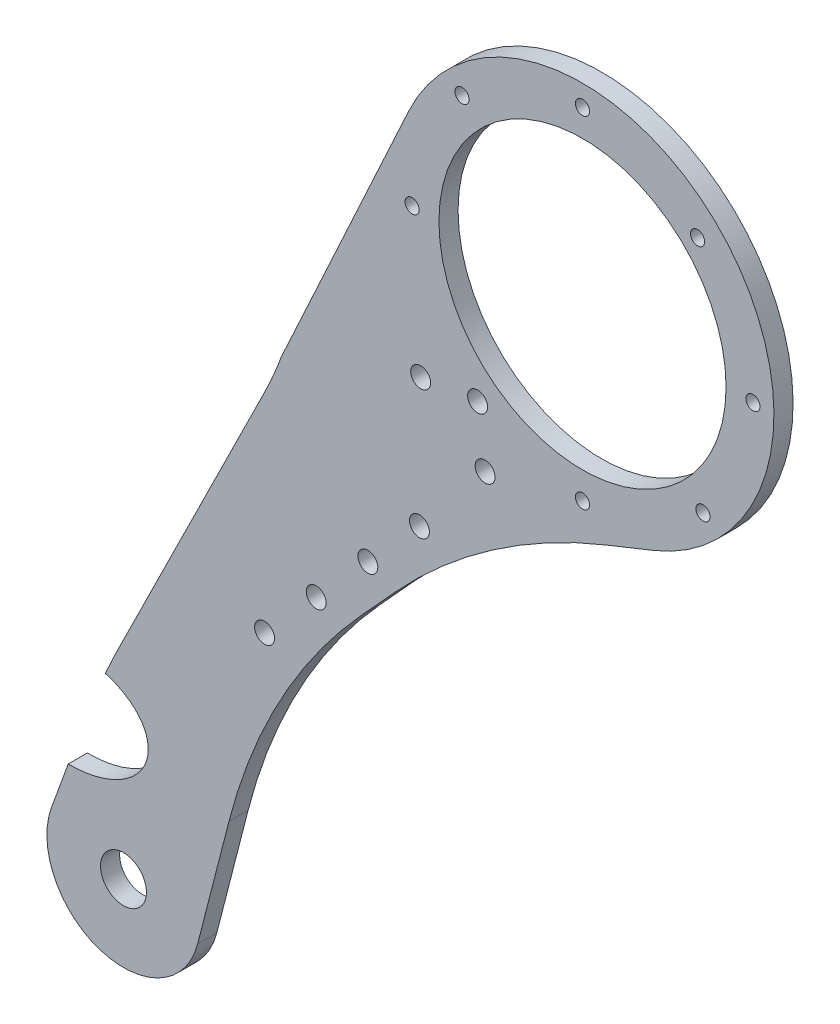
ISO-10303-21;
HEADER;
FILE_DESCRIPTION(('STEP AP214'),'2;1');
FILE_NAME('part.step','',(''),(''),'','','');
FILE_SCHEMA(('AUTOMOTIVE_DESIGN { 1 0 10303 214 1 1 1 1 }'));
ENDSEC;
DATA;
#1=APPLICATION_CONTEXT('core data for automotive mechanical design processes');
#2=APPLICATION_PROTOCOL_DEFINITION('international standard','automotive_design',2000,#1);
#3=PRODUCT_CONTEXT('',#1,'mechanical');
#4=PRODUCT('Part','Part','',(#3));
#5=PRODUCT_RELATED_PRODUCT_CATEGORY('part','',(#4));
#6=PRODUCT_DEFINITION_FORMATION('','',#4);
#7=PRODUCT_DEFINITION_CONTEXT('part definition',#1,'design');
#8=PRODUCT_DEFINITION('design','',#6,#7);
#9=PRODUCT_DEFINITION_SHAPE('','',#8);
#10=(LENGTH_UNIT() NAMED_UNIT(*) SI_UNIT(.MILLI.,.METRE.));
#11=(NAMED_UNIT(*) PLANE_ANGLE_UNIT() SI_UNIT($,.RADIAN.));
#12=(NAMED_UNIT(*) SI_UNIT($,.STERADIAN.) SOLID_ANGLE_UNIT());
#13=UNCERTAINTY_MEASURE_WITH_UNIT(LENGTH_MEASURE(1.E-05),#10,'distance_accuracy_value','');
#14=(GEOMETRIC_REPRESENTATION_CONTEXT(3) GLOBAL_UNCERTAINTY_ASSIGNED_CONTEXT((#13)) GLOBAL_UNIT_ASSIGNED_CONTEXT((#10,
#11,#12)) REPRESENTATION_CONTEXT('',''));
#15=CARTESIAN_POINT('',(0.,0.,0.));
#16=DIRECTION('',(0.,0.,1.));
#17=DIRECTION('',(1.,0.,0.));
#18=AXIS2_PLACEMENT_3D('',#15,#16,#17);
#19=CARTESIAN_POINT('',(-92.5685975077157,-82.8702446991092,-5.));
#20=DIRECTION('',(0.,0.,-1.));
#21=DIRECTION('',(1.,0.,0.));
#22=AXIS2_PLACEMENT_3D('',#19,#20,#21);
#23=PLANE('',#22);
#24=CARTESIAN_POINT('',(13.0554677029552,39.3964383545388,-5.));
#25=DIRECTION('',(0.,0.,1.));
#26=DIRECTION('',(1.,0.,0.));
#27=AXIS2_PLACEMENT_3D('',#24,#25,#26);
#28=CIRCLE('',#27,2.6);
#29=CARTESIAN_POINT('',(15.6554677029552,39.3964383545388,-5.));
#30=VERTEX_POINT('',#29);
#31=EDGE_CURVE('E406',#30,#30,#28,.T.);
#32=ORIENTED_EDGE('',*,*,#31,.T.);
#33=EDGE_LOOP('',(#32));
#34=FACE_BOUND('',#33,.T.);
#35=CARTESIAN_POINT('',(-2.12692773331795,3.57822311802661,-5.));
#36=DIRECTION('',(0.,0.,1.));
#37=DIRECTION('',(1.,0.,0.));
#38=AXIS2_PLACEMENT_3D('',#35,#36,#37);
#39=CIRCLE('',#38,2.6);
#40=CARTESIAN_POINT('',(0.473072266682053,3.57822311802661,-5.));
#41=VERTEX_POINT('',#40);
#42=EDGE_CURVE('E389',#41,#41,#39,.T.);
#43=ORIENTED_EDGE('',*,*,#42,.T.);
#44=EDGE_LOOP('',(#43));
#45=FACE_BOUND('',#44,.T.);
#46=CARTESIAN_POINT('',(-29.0960098710009,-25.9627418061412,-5.));
#47=DIRECTION('',(0.,0.,1.));
#48=DIRECTION('',(1.,0.,0.));
#49=AXIS2_PLACEMENT_3D('',#46,#47,#48);
#50=CIRCLE('',#49,2.6);
#51=CARTESIAN_POINT('',(-26.4960098710009,-25.9627418061412,-5.));
#52=VERTEX_POINT('',#51);
#53=EDGE_CURVE('E450',#52,#52,#50,.T.);
#54=ORIENTED_EDGE('',*,*,#53,.T.);
#55=EDGE_LOOP('',(#54));
#56=FACE_BOUND('',#55,.T.);
#57=CARTESIAN_POINT('',(-15.6114688021594,-11.1922593440573,-5.));
#58=DIRECTION('',(0.,0.,1.));
#59=DIRECTION('',(1.,0.,0.));
#60=AXIS2_PLACEMENT_3D('',#57,#58,#59);
#61=CIRCLE('',#60,2.6);
#62=CARTESIAN_POINT('',(-13.0114688021594,-11.1922593440573,-5.));
#63=VERTEX_POINT('',#62);
#64=EDGE_CURVE('E454',#63,#63,#61,.T.);
#65=ORIENTED_EDGE('',*,*,#64,.T.);
#66=EDGE_LOOP('',(#65));
#67=FACE_BOUND('',#66,.T.);
#68=CARTESIAN_POINT('',(-42.5805509398424,-40.7332242682251,-5.));
#69=DIRECTION('',(0.,0.,1.));
#70=DIRECTION('',(1.,0.,0.));
#71=AXIS2_PLACEMENT_3D('',#68,#69,#70);
#72=CIRCLE('',#71,2.6);
#73=CARTESIAN_POINT('',(-39.9805509398424,-40.7332242682251,-5.));
#74=VERTEX_POINT('',#73);
#75=EDGE_CURVE('E405',#74,#74,#72,.T.);
#76=ORIENTED_EDGE('',*,*,#75,.T.);
#77=EDGE_LOOP('',(#76));
#78=FACE_BOUND('',#77,.T.);
#79=CARTESIAN_POINT('',(40.4497320083475,75.0973386676444,-5.));
#80=DIRECTION('',(0.,0.,1.));
#81=DIRECTION('',(1.,0.,0.));
#82=AXIS2_PLACEMENT_3D('',#79,#80,#81);
#83=CIRCLE('',#82,37.5);
#84=CARTESIAN_POINT('',(77.9497320083475,75.0973386676444,-5.));
#85=VERTEX_POINT('',#84);
#86=EDGE_CURVE('E173',#85,#85,#83,.T.);
#87=ORIENTED_EDGE('',*,*,#86,.T.);
#88=EDGE_LOOP('',(#87));
#89=FACE_BOUND('',#88,.T.);
#90=CARTESIAN_POINT('',(70.5017702087758,105.149376868073,-5.));
#91=DIRECTION('',(0.,0.,1.));
#92=DIRECTION('',(1.,0.,0.));
#93=AXIS2_PLACEMENT_3D('',#90,#91,#92);
#94=CIRCLE('',#93,1.85000000000002);
#95=CARTESIAN_POINT('',(72.3517702087758,105.149376868073,-5.));
#96=VERTEX_POINT('',#95);
#97=EDGE_CURVE('E184',#96,#96,#94,.T.);
#98=ORIENTED_EDGE('',*,*,#97,.T.);
#99=EDGE_LOOP('',(#98));
#100=FACE_BOUND('',#99,.T.);
#101=CARTESIAN_POINT('',(-1.81620521765199,37.438545471238,-5.));
#102=DIRECTION('',(0.,0.,1.));
#103=DIRECTION('',(1.,0.,0.));
#104=AXIS2_PLACEMENT_3D('',#101,#102,#103);
#105=CIRCLE('',#104,2.6);
#106=CARTESIAN_POINT('',(0.783794782348011,37.438545471238,-5.));
#107=VERTEX_POINT('',#106);
#108=EDGE_CURVE('E194',#107,#107,#105,.T.);
#109=ORIENTED_EDGE('',*,*,#108,.T.);
#110=EDGE_LOOP('',(#109));
#111=FACE_BOUND('',#110,.T.);
#112=CARTESIAN_POINT('',(15.013360586256,24.5247654339316,-5.));
#113=DIRECTION('',(0.,0.,1.));
#114=DIRECTION('',(1.,0.,0.));
#115=AXIS2_PLACEMENT_3D('',#112,#113,#114);
#116=CIRCLE('',#115,2.6);
#117=CARTESIAN_POINT('',(17.613360586256,24.5247654339316,-5.));
#118=VERTEX_POINT('',#117);
#119=EDGE_CURVE('E202',#118,#118,#116,.T.);
#120=ORIENTED_EDGE('',*,*,#119,.T.);
#121=EDGE_LOOP('',(#120));
#122=FACE_BOUND('',#121,.T.);
#123=CARTESIAN_POINT('',(40.4497320083475,119.597338667644,-5.));
#124=DIRECTION('',(0.,0.,1.));
#125=DIRECTION('',(1.,0.,0.));
#126=AXIS2_PLACEMENT_3D('',#123,#124,#125);
#127=CIRCLE('',#126,1.85);
#128=CARTESIAN_POINT('',(42.2997320083475,119.597338667644,-5.));
#129=VERTEX_POINT('',#128);
#130=EDGE_CURVE('E206',#129,#129,#127,.T.);
#131=ORIENTED_EDGE('',*,*,#130,.T.);
#132=EDGE_LOOP('',(#131));
#133=FACE_BOUND('',#132,.T.);
#134=CARTESIAN_POINT('',(40.4497320083475,30.5973386676444,-5.));
#135=DIRECTION('',(0.,0.,1.));
#136=DIRECTION('',(1.,0.,0.));
#137=AXIS2_PLACEMENT_3D('',#134,#135,#136);
#138=CIRCLE('',#137,1.85);
#139=CARTESIAN_POINT('',(42.2997320083475,30.5973386676444,-5.));
#140=VERTEX_POINT('',#139);
#141=EDGE_CURVE('E222',#140,#140,#138,.T.);
#142=ORIENTED_EDGE('',*,*,#141,.T.);
#143=EDGE_LOOP('',(#142));
#144=FACE_BOUND('',#143,.T.);
#145=CARTESIAN_POINT('',(71.9159837711489,43.6310869048431,-5.));
#146=DIRECTION('',(0.,0.,1.));
#147=DIRECTION('',(1.,0.,0.));
#148=AXIS2_PLACEMENT_3D('',#145,#146,#147);
#149=CIRCLE('',#148,1.84999999999999);
#150=CARTESIAN_POINT('',(73.7659837711489,43.6310869048431,-5.));
#151=VERTEX_POINT('',#150);
#152=EDGE_CURVE('E238',#151,#151,#149,.T.);
#153=ORIENTED_EDGE('',*,*,#152,.T.);
#154=EDGE_LOOP('',(#153));
#155=FACE_BOUND('',#154,.T.);
#156=CARTESIAN_POINT('',(84.9497320083475,75.0973386676444,-5.));
#157=DIRECTION('',(0.,0.,1.));
#158=DIRECTION('',(1.,0.,0.));
#159=AXIS2_PLACEMENT_3D('',#156,#157,#158);
#160=CIRCLE('',#159,1.85);
#161=CARTESIAN_POINT('',(86.7997320083475,75.0973386676444,-5.));
#162=VERTEX_POINT('',#161);
#163=EDGE_CURVE('E254',#162,#162,#160,.T.);
#164=ORIENTED_EDGE('',*,*,#163,.T.);
#165=EDGE_LOOP('',(#164));
#166=FACE_BOUND('',#165,.T.);
#167=CARTESIAN_POINT('',(-4.05026799165248,75.0973386676444,-5.));
#168=DIRECTION('',(0.,0.,1.));
#169=DIRECTION('',(1.,0.,0.));
#170=AXIS2_PLACEMENT_3D('',#167,#168,#169);
#171=CIRCLE('',#170,1.85);
#172=CARTESIAN_POINT('',(-2.20026799165248,75.0973386676444,-5.));
#173=VERTEX_POINT('',#172);
#174=EDGE_CURVE('E246',#173,#173,#171,.T.);
#175=ORIENTED_EDGE('',*,*,#174,.T.);
#176=EDGE_LOOP('',(#175));
#177=FACE_BOUND('',#176,.T.);
#178=CARTESIAN_POINT('',(-79.4291349249004,-114.893219250955,-5.));
#179=DIRECTION('',(0.,0.,1.));
#180=DIRECTION('',(1.,0.,0.));
#181=AXIS2_PLACEMENT_3D('',#178,#179,#180);
#182=CIRCLE('',#181,6.00000000000002);
#183=CARTESIAN_POINT('',(-73.4291349249004,-114.893219250955,-5.));
#184=VERTEX_POINT('',#183);
#185=EDGE_CURVE('E230',#184,#184,#182,.T.);
#186=ORIENTED_EDGE('',*,*,#185,.T.);
#187=EDGE_LOOP('',(#186));
#188=FACE_BOUND('',#187,.T.);
#189=CARTESIAN_POINT('',(8.98348024554615,106.563590430446,-5.));
#190=DIRECTION('',(0.,0.,1.));
#191=DIRECTION('',(1.,0.,0.));
#192=AXIS2_PLACEMENT_3D('',#189,#190,#191);
#193=CIRCLE('',#192,1.85);
#194=CARTESIAN_POINT('',(10.8334802455462,106.563590430446,-5.));
#195=VERTEX_POINT('',#194);
#196=EDGE_CURVE('E214',#195,#195,#193,.T.);
#197=ORIENTED_EDGE('',*,*,#196,.T.);
#198=EDGE_LOOP('',(#197));
#199=FACE_BOUND('',#198,.T.);
#200=CARTESIAN_POINT('',(-79.4291349249004,-114.893219250955,-5.));
#201=DIRECTION('',(0.,0.,1.));
#202=DIRECTION('',(1.,0.,0.));
#203=AXIS2_PLACEMENT_3D('',#200,#201,#202);
#204=CIRCLE('',#203,20.0000000000002);
#205=CARTESIAN_POINT('',(-98.2229873406187,-108.052816384441,-5.));
#206=VERTEX_POINT('',#205);
#207=CARTESIAN_POINT('',(-60.0584967359329,-119.871007530112,-5.));
#208=VERTEX_POINT('',#207);
#209=EDGE_CURVE('E363',#206,#208,#204,.T.);
#210=ORIENTED_EDGE('',*,*,#209,.F.);
#211=DIRECTION('',(-0.342020143325669,-0.939692620785908,0.));
#212=VECTOR('',#211,1.);
#213=CARTESIAN_POINT('',(-93.8567760538922,-96.0567494655923,-5.));
#214=LINE('',#213,#212);
#215=CARTESIAN_POINT('',(-93.8567760538922,-96.0567494655923,-5.));
#216=VERTEX_POINT('',#215);
#217=EDGE_CURVE('E280',#216,#206,#214,.T.);
#218=ORIENTED_EDGE('',*,*,#217,.F.);
#219=CARTESIAN_POINT('',(-92.5685975077157,-82.8702446991092,-5.));
#220=DIRECTION('',(0.,0.,-1.));
#221=DIRECTION('',(0.998564288915161,0.0535664158158636,0.));
#222=AXIS2_PLACEMENT_3D('',#219,#220,#221);
#223=ELLIPSE('',#222,19.6254544070607,13.1666159932936);
#224=CARTESIAN_POINT('',(-84.151417051104,-70.7208521221517,-5.));
#225=VERTEX_POINT('',#224);
#226=EDGE_CURVE('E275',#225,#216,#223,.T.);
#227=ORIENTED_EDGE('',*,*,#226,.F.);
#228=CARTESIAN_POINT('',(98.750066811929,-151.634677891922,-5.));
#229=DIRECTION('',(0.,0.,1.));
#230=DIRECTION('',(1.,0.,0.));
#231=AXIS2_PLACEMENT_3D('',#228,#229,#230);
#232=CIRCLE('',#231,200.);
#233=CARTESIAN_POINT('',(-80.4781362784233,-62.8807978809415,-5.));
#234=VERTEX_POINT('',#233);
#235=EDGE_CURVE('E271',#234,#225,#232,.T.);
#236=ORIENTED_EDGE('',*,*,#235,.F.);
#237=DIRECTION('',(-0.4437694000549,-0.896141015451761,0.));
#238=VECTOR('',#237,1.);
#239=CARTESIAN_POINT('',(-42.5310244349342,13.749008808476,-5.));
#240=LINE('',#239,#238);
#241=CARTESIAN_POINT('',(-42.5310244349342,13.749008808476,-5.));
#242=VERTEX_POINT('',#241);
#243=EDGE_CURVE('E266',#242,#234,#240,.T.);
#244=ORIENTED_EDGE('',*,*,#243,.F.);
#245=CARTESIAN_POINT('',(-132.14512598011,58.125948813966,-5.));
#246=DIRECTION('',(0.,0.,-1.));
#247=DIRECTION('',(1.,0.,0.));
#248=AXIS2_PLACEMENT_3D('',#245,#246,#247);
#249=CIRCLE('',#248,100.);
#250=CARTESIAN_POINT('',(-38.1758639015197,23.9239344813986,-5.));
#251=VERTEX_POINT('',#250);
#252=EDGE_CURVE('E262',#251,#242,#249,.T.);
#253=ORIENTED_EDGE('',*,*,#252,.F.);
#254=DIRECTION('',(0.418420104800895,0.908253607699088,0.));
#255=VECTOR('',#254,1.);
#256=CARTESIAN_POINT('',(-40.5840602403773,18.6965255024349,-5.));
#257=LINE('',#256,#255);
#258=CARTESIAN_POINT('',(-4.96294837660688,96.0183439076892,-5.));
#259=VERTEX_POINT('',#258);
#260=EDGE_CURVE('E164',#251,#259,#257,.T.);
#261=ORIENTED_EDGE('',*,*,#260,.T.);
#262=CARTESIAN_POINT('',(40.4497320083475,75.0973386676444,-5.));
#263=DIRECTION('',(0.,0.,1.));
#264=DIRECTION('',(1.,0.,0.));
#265=AXIS2_PLACEMENT_3D('',#262,#263,#264);
#266=CIRCLE('',#265,50.);
#267=CARTESIAN_POINT('',(59.0552156516365,28.6879002052012,-5.));
#268=VERTEX_POINT('',#267);
#269=EDGE_CURVE('E144',#268,#259,#266,.T.);
#270=ORIENTED_EDGE('',*,*,#269,.F.);
#271=DIRECTION('',(0.928188769248865,0.372109672865779,0.));
#272=VECTOR('',#271,1.);
#273=CARTESIAN_POINT('',(-1.73134065067284,4.31864868043409,-5.));
#274=LINE('',#273,#272);
#275=CARTESIAN_POINT('',(46.5652207080824,23.680677443497,-5.));
#276=VERTEX_POINT('',#275);
#277=EDGE_CURVE('E154',#276,#268,#274,.T.);
#278=ORIENTED_EDGE('',*,*,#277,.F.);
#279=CARTESIAN_POINT('',(102.381671637949,-115.547637943833,-5.));
#280=DIRECTION('',(0.,0.,1.));
#281=DIRECTION('',(1.,0.,0.));
#282=AXIS2_PLACEMENT_3D('',#279,#280,#281);
#283=CIRCLE('',#282,150.);
#284=CARTESIAN_POINT('',(-8.39694682767989,-14.4135799275218,-5.));
#285=VERTEX_POINT('',#284);
#286=EDGE_CURVE('E56',#285,#276,#283,.F.);
#287=ORIENTED_EDGE('',*,*,#286,.F.);
#288=DIRECTION('',(0.674227053442073,0.738524123104195,0.));
#289=VECTOR('',#288,1.);
#290=CARTESIAN_POINT('',(2.59715133783699,-2.37103926476065,-5.));
#291=LINE('',#290,#289);
#292=CARTESIAN_POINT('',(-17.381541248407,-24.2549822891438,-5.));
#293=VERTEX_POINT('',#292);
#294=EDGE_CURVE('E159',#293,#285,#291,.T.);
#295=ORIENTED_EDGE('',*,*,#294,.F.);
#296=CARTESIAN_POINT('',(93.3970772172222,-125.389040305455,-5.));
#297=DIRECTION('',(0.,0.,1.));
#298=DIRECTION('',(1.,0.,0.));
#299=AXIS2_PLACEMENT_3D('',#296,#297,#298);
#300=CIRCLE('',#299,150.);
#301=CARTESIAN_POINT('',(-51.8827092000331,-88.055628211773,-5.));
#302=VERTEX_POINT('',#301);
#303=EDGE_CURVE('E426',#302,#293,#300,.F.);
#304=ORIENTED_EDGE('',*,*,#303,.F.);
#305=DIRECTION('',(-0.248889413957879,-0.968531909448369,0.));
#306=VECTOR('',#305,1.);
#307=CARTESIAN_POINT('',(-27.4423305383315,7.05201914226437,-5.));
#308=LINE('',#307,#306);
#309=EDGE_CURVE('E151',#302,#208,#308,.T.);
#310=ORIENTED_EDGE('',*,*,#309,.T.);
#311=EDGE_LOOP('',(#210,#218,#227,#236,#244,#253,#261,#270,#278,#287,#295,#304,#310));
#312=FACE_BOUND('',#311,.T.);
#313=ADVANCED_FACE('F47',(#34,#45,#56,#67,#78,#89,#100,#111,#122,#133,#144,#155,#166,#177,#188,
#199,#312),#23,.T.);
#314=CARTESIAN_POINT('',(-92.5685975077157,-82.8702446991092,0.));
#315=DIRECTION('',(0.,0.,-1.));
#316=DIRECTION('',(1.,0.,0.));
#317=AXIS2_PLACEMENT_3D('',#314,#315,#316);
#318=PLANE('',#317);
#319=CARTESIAN_POINT('',(40.4497320083475,119.597338667644,0.));
#320=DIRECTION('',(0.,0.,1.));
#321=DIRECTION('',(1.,0.,0.));
#322=AXIS2_PLACEMENT_3D('',#319,#320,#321);
#323=CIRCLE('',#322,1.85);
#324=CARTESIAN_POINT('',(42.2997320083475,119.597338667644,0.));
#325=VERTEX_POINT('',#324);
#326=EDGE_CURVE('E193',#325,#325,#323,.T.);
#327=ORIENTED_EDGE('',*,*,#326,.F.);
#328=EDGE_LOOP('',(#327));
#329=FACE_BOUND('',#328,.T.);
#330=CARTESIAN_POINT('',(8.98348024554615,106.563590430446,0.));
#331=DIRECTION('',(0.,0.,1.));
#332=DIRECTION('',(1.,0.,0.));
#333=AXIS2_PLACEMENT_3D('',#330,#331,#332);
#334=CIRCLE('',#333,1.85);
#335=CARTESIAN_POINT('',(10.8334802455462,106.563590430446,0.));
#336=VERTEX_POINT('',#335);
#337=EDGE_CURVE('E210',#336,#336,#334,.T.);
#338=ORIENTED_EDGE('',*,*,#337,.F.);
#339=EDGE_LOOP('',(#338));
#340=FACE_BOUND('',#339,.T.);
#341=CARTESIAN_POINT('',(40.4497320083475,30.5973386676444,0.));
#342=DIRECTION('',(0.,0.,1.));
#343=DIRECTION('',(1.,0.,0.));
#344=AXIS2_PLACEMENT_3D('',#341,#342,#343);
#345=CIRCLE('',#344,1.85);
#346=CARTESIAN_POINT('',(42.2997320083475,30.5973386676444,0.));
#347=VERTEX_POINT('',#346);
#348=EDGE_CURVE('E218',#347,#347,#345,.T.);
#349=ORIENTED_EDGE('',*,*,#348,.F.);
#350=EDGE_LOOP('',(#349));
#351=FACE_BOUND('',#350,.T.);
#352=CARTESIAN_POINT('',(-79.4291349249004,-114.893219250955,0.));
#353=DIRECTION('',(0.,0.,1.));
#354=DIRECTION('',(1.,0.,0.));
#355=AXIS2_PLACEMENT_3D('',#352,#353,#354);
#356=CIRCLE('',#355,6.00000000000002);
#357=CARTESIAN_POINT('',(-73.4291349249004,-114.893219250955,0.));
#358=VERTEX_POINT('',#357);
#359=EDGE_CURVE('E226',#358,#358,#356,.T.);
#360=ORIENTED_EDGE('',*,*,#359,.F.);
#361=EDGE_LOOP('',(#360));
#362=FACE_BOUND('',#361,.T.);
#363=CARTESIAN_POINT('',(71.9159837711489,43.6310869048431,0.));
#364=DIRECTION('',(0.,0.,1.));
#365=DIRECTION('',(1.,0.,0.));
#366=AXIS2_PLACEMENT_3D('',#363,#364,#365);
#367=CIRCLE('',#366,1.84999999999999);
#368=CARTESIAN_POINT('',(73.7659837711489,43.6310869048431,0.));
#369=VERTEX_POINT('',#368);
#370=EDGE_CURVE('E234',#369,#369,#367,.T.);
#371=ORIENTED_EDGE('',*,*,#370,.F.);
#372=EDGE_LOOP('',(#371));
#373=FACE_BOUND('',#372,.T.);
#374=CARTESIAN_POINT('',(-4.05026799165248,75.0973386676444,0.));
#375=DIRECTION('',(0.,0.,1.));
#376=DIRECTION('',(1.,0.,0.));
#377=AXIS2_PLACEMENT_3D('',#374,#375,#376);
#378=CIRCLE('',#377,1.85);
#379=CARTESIAN_POINT('',(-2.20026799165248,75.0973386676444,0.));
#380=VERTEX_POINT('',#379);
#381=EDGE_CURVE('E242',#380,#380,#378,.T.);
#382=ORIENTED_EDGE('',*,*,#381,.F.);
#383=EDGE_LOOP('',(#382));
#384=FACE_BOUND('',#383,.T.);
#385=CARTESIAN_POINT('',(84.9497320083475,75.0973386676444,0.));
#386=DIRECTION('',(0.,0.,1.));
#387=DIRECTION('',(1.,0.,0.));
#388=AXIS2_PLACEMENT_3D('',#385,#386,#387);
#389=CIRCLE('',#388,1.85);
#390=CARTESIAN_POINT('',(86.7997320083475,75.0973386676444,0.));
#391=VERTEX_POINT('',#390);
#392=EDGE_CURVE('E250',#391,#391,#389,.T.);
#393=ORIENTED_EDGE('',*,*,#392,.F.);
#394=EDGE_LOOP('',(#393));
#395=FACE_BOUND('',#394,.T.);
#396=CARTESIAN_POINT('',(15.013360586256,24.5247654339316,0.));
#397=DIRECTION('',(0.,0.,1.));
#398=DIRECTION('',(1.,0.,0.));
#399=AXIS2_PLACEMENT_3D('',#396,#397,#398);
#400=CIRCLE('',#399,2.6);
#401=CARTESIAN_POINT('',(17.613360586256,24.5247654339316,0.));
#402=VERTEX_POINT('',#401);
#403=EDGE_CURVE('E198',#402,#402,#400,.T.);
#404=ORIENTED_EDGE('',*,*,#403,.F.);
#405=EDGE_LOOP('',(#404));
#406=FACE_BOUND('',#405,.T.);
#407=CARTESIAN_POINT('',(-1.81620521765199,37.438545471238,0.));
#408=DIRECTION('',(0.,0.,1.));
#409=DIRECTION('',(1.,0.,0.));
#410=AXIS2_PLACEMENT_3D('',#407,#408,#409);
#411=CIRCLE('',#410,2.6);
#412=CARTESIAN_POINT('',(0.783794782348011,37.438545471238,0.));
#413=VERTEX_POINT('',#412);
#414=EDGE_CURVE('E189',#413,#413,#411,.T.);
#415=ORIENTED_EDGE('',*,*,#414,.F.);
#416=EDGE_LOOP('',(#415));
#417=FACE_BOUND('',#416,.T.);
#418=CARTESIAN_POINT('',(70.5017702087758,105.149376868073,0.));
#419=DIRECTION('',(0.,0.,1.));
#420=DIRECTION('',(1.,0.,0.));
#421=AXIS2_PLACEMENT_3D('',#418,#419,#420);
#422=CIRCLE('',#421,1.85000000000002);
#423=CARTESIAN_POINT('',(72.3517702087758,105.149376868073,0.));
#424=VERTEX_POINT('',#423);
#425=EDGE_CURVE('E188',#424,#424,#422,.T.);
#426=ORIENTED_EDGE('',*,*,#425,.F.);
#427=EDGE_LOOP('',(#426));
#428=FACE_BOUND('',#427,.T.);
#429=CARTESIAN_POINT('',(40.4497320083475,75.0973386676444,0.));
#430=DIRECTION('',(0.,0.,1.));
#431=DIRECTION('',(1.,0.,0.));
#432=AXIS2_PLACEMENT_3D('',#429,#430,#431);
#433=CIRCLE('',#432,37.5);
#434=CARTESIAN_POINT('',(77.9497320083475,75.0973386676444,0.));
#435=VERTEX_POINT('',#434);
#436=EDGE_CURVE('E166',#435,#435,#433,.T.);
#437=ORIENTED_EDGE('',*,*,#436,.F.);
#438=EDGE_LOOP('',(#437));
#439=FACE_BOUND('',#438,.T.);
#440=CARTESIAN_POINT('',(-42.5805509398424,-40.7332242682251,0.));
#441=DIRECTION('',(0.,0.,1.));
#442=DIRECTION('',(1.,0.,0.));
#443=AXIS2_PLACEMENT_3D('',#440,#441,#442);
#444=CIRCLE('',#443,2.6);
#445=CARTESIAN_POINT('',(-39.9805509398424,-40.7332242682251,0.));
#446=VERTEX_POINT('',#445);
#447=EDGE_CURVE('E384',#446,#446,#444,.T.);
#448=ORIENTED_EDGE('',*,*,#447,.F.);
#449=EDGE_LOOP('',(#448));
#450=FACE_BOUND('',#449,.T.);
#451=CARTESIAN_POINT('',(-15.6114688021594,-11.1922593440573,0.));
#452=DIRECTION('',(0.,0.,1.));
#453=DIRECTION('',(1.,0.,0.));
#454=AXIS2_PLACEMENT_3D('',#451,#452,#453);
#455=CIRCLE('',#454,2.6);
#456=CARTESIAN_POINT('',(-13.0114688021594,-11.1922593440573,0.));
#457=VERTEX_POINT('',#456);
#458=EDGE_CURVE('E388',#457,#457,#455,.T.);
#459=ORIENTED_EDGE('',*,*,#458,.F.);
#460=EDGE_LOOP('',(#459));
#461=FACE_BOUND('',#460,.T.);
#462=CARTESIAN_POINT('',(-29.0960098710009,-25.9627418061412,0.));
#463=DIRECTION('',(0.,0.,1.));
#464=DIRECTION('',(1.,0.,0.));
#465=AXIS2_PLACEMENT_3D('',#462,#463,#464);
#466=CIRCLE('',#465,2.6);
#467=CARTESIAN_POINT('',(-26.4960098710009,-25.9627418061412,0.));
#468=VERTEX_POINT('',#467);
#469=EDGE_CURVE('E393',#468,#468,#466,.T.);
#470=ORIENTED_EDGE('',*,*,#469,.F.);
#471=EDGE_LOOP('',(#470));
#472=FACE_BOUND('',#471,.T.);
#473=CARTESIAN_POINT('',(-2.12692773331795,3.57822311802661,0.));
#474=DIRECTION('',(0.,0.,1.));
#475=DIRECTION('',(1.,0.,0.));
#476=AXIS2_PLACEMENT_3D('',#473,#474,#475);
#477=CIRCLE('',#476,2.6);
#478=CARTESIAN_POINT('',(0.473072266682053,3.57822311802661,0.));
#479=VERTEX_POINT('',#478);
#480=EDGE_CURVE('E397',#479,#479,#477,.T.);
#481=ORIENTED_EDGE('',*,*,#480,.F.);
#482=EDGE_LOOP('',(#481));
#483=FACE_BOUND('',#482,.T.);
#484=CARTESIAN_POINT('',(13.0554677029552,39.3964383545388,0.));
#485=DIRECTION('',(0.,0.,1.));
#486=DIRECTION('',(1.,0.,0.));
#487=AXIS2_PLACEMENT_3D('',#484,#485,#486);
#488=CIRCLE('',#487,2.6);
#489=CARTESIAN_POINT('',(15.6554677029552,39.3964383545388,0.));
#490=VERTEX_POINT('',#489);
#491=EDGE_CURVE('E401',#490,#490,#488,.T.);
#492=ORIENTED_EDGE('',*,*,#491,.F.);
#493=EDGE_LOOP('',(#492));
#494=FACE_BOUND('',#493,.T.);
#495=DIRECTION('',(0.674227053442073,0.738524123104195,0.));
#496=VECTOR('',#495,1.);
#497=CARTESIAN_POINT('',(-80.7467027896559,-93.6629067022912,0.));
#498=LINE('',#497,#496);
#499=CARTESIAN_POINT('',(-17.3815412484069,-24.2549822891438,0.));
#500=VERTEX_POINT('',#499);
#501=CARTESIAN_POINT('',(-8.39694682767987,-14.4135799275218,0.));
#502=VERTEX_POINT('',#501);
#503=EDGE_CURVE('E409',#500,#502,#498,.T.);
#504=ORIENTED_EDGE('',*,*,#503,.T.);
#505=CARTESIAN_POINT('',(102.381671637949,-115.547637943833,0.));
#506=DIRECTION('',(0.,0.,1.));
#507=DIRECTION('',(1.,0.,0.));
#508=AXIS2_PLACEMENT_3D('',#505,#506,#507);
#509=CIRCLE('',#508,150.);
#510=CARTESIAN_POINT('',(46.5652207080824,23.680677443497,0.));
#511=VERTEX_POINT('',#510);
#512=EDGE_CURVE('E11',#511,#502,#509,.T.);
#513=ORIENTED_EDGE('',*,*,#512,.F.);
#514=DIRECTION('',(0.928188769248865,0.372109672865779,0.));
#515=VECTOR('',#514,1.);
#516=CARTESIAN_POINT('',(-110.104760637619,-39.1281147309813,0.));
#517=LINE('',#516,#515);
#518=CARTESIAN_POINT('',(59.0552156516365,28.6879002052012,0.));
#519=VERTEX_POINT('',#518);
#520=EDGE_CURVE('E382',#511,#519,#517,.T.);
#521=ORIENTED_EDGE('',*,*,#520,.T.);
#522=CARTESIAN_POINT('',(40.4497320083475,75.0973386676444,0.));
#523=DIRECTION('',(0.,0.,1.));
#524=DIRECTION('',(1.,0.,0.));
#525=AXIS2_PLACEMENT_3D('',#522,#523,#524);
#526=CIRCLE('',#525,50.);
#527=CARTESIAN_POINT('',(-4.96294837660688,96.0183439076892,0.));
#528=VERTEX_POINT('',#527);
#529=EDGE_CURVE('E147',#519,#528,#526,.T.);
#530=ORIENTED_EDGE('',*,*,#529,.T.);
#531=DIRECTION('',(0.418420104800895,0.908253607699088,0.));
#532=VECTOR('',#531,1.);
#533=CARTESIAN_POINT('',(-88.2838521808065,-84.8441686929509,0.));
#534=LINE('',#533,#532);
#535=CARTESIAN_POINT('',(-38.1758639015197,23.9239344813986,0.));
#536=VERTEX_POINT('',#535);
#537=EDGE_CURVE('E180',#536,#528,#534,.T.);
#538=ORIENTED_EDGE('',*,*,#537,.F.);
#539=CARTESIAN_POINT('',(-132.14512598011,58.125948813966,0.));
#540=DIRECTION('',(0.,0.,-1.));
#541=DIRECTION('',(1.,0.,0.));
#542=AXIS2_PLACEMENT_3D('',#539,#540,#541);
#543=CIRCLE('',#542,100.);
#544=CARTESIAN_POINT('',(-42.5310244349342,13.749008808476,0.));
#545=VERTEX_POINT('',#544);
#546=EDGE_CURVE('E258',#536,#545,#543,.T.);
#547=ORIENTED_EDGE('',*,*,#546,.T.);
#548=DIRECTION('',(-0.4437694000549,-0.896141015451761,0.));
#549=VECTOR('',#548,1.);
#550=CARTESIAN_POINT('',(-42.5310244349342,13.749008808476,0.));
#551=LINE('',#550,#549);
#552=CARTESIAN_POINT('',(-80.4781362784233,-62.8807978809415,0.));
#553=VERTEX_POINT('',#552);
#554=EDGE_CURVE('E801',#545,#553,#551,.T.);
#555=ORIENTED_EDGE('',*,*,#554,.T.);
#556=CARTESIAN_POINT('',(98.750066811929,-151.634677891922,0.));
#557=DIRECTION('',(0.,0.,1.));
#558=DIRECTION('',(1.,0.,0.));
#559=AXIS2_PLACEMENT_3D('',#556,#557,#558);
#560=CIRCLE('',#559,200.);
#561=CARTESIAN_POINT('',(-84.151417051104,-70.7208521221517,0.));
#562=VERTEX_POINT('',#561);
#563=EDGE_CURVE('E356',#553,#562,#560,.T.);
#564=ORIENTED_EDGE('',*,*,#563,.T.);
#565=CARTESIAN_POINT('',(-92.5685975077157,-82.8702446991092,0.));
#566=DIRECTION('',(0.,0.,-1.));
#567=DIRECTION('',(0.998564288915161,0.0535664158158636,0.));
#568=AXIS2_PLACEMENT_3D('',#565,#566,#567);
#569=ELLIPSE('',#568,19.6254544070607,13.1666159932936);
#570=CARTESIAN_POINT('',(-93.8567760538922,-96.0567494655923,0.));
#571=VERTEX_POINT('',#570);
#572=EDGE_CURVE('E352',#562,#571,#569,.T.);
#573=ORIENTED_EDGE('',*,*,#572,.T.);
#574=DIRECTION('',(-0.342020143325669,-0.939692620785908,0.));
#575=VECTOR('',#574,1.);
#576=CARTESIAN_POINT('',(-93.8567760538922,-96.0567494655923,0.));
#577=LINE('',#576,#575);
#578=CARTESIAN_POINT('',(-98.2229873406187,-108.052816384441,0.));
#579=VERTEX_POINT('',#578);
#580=EDGE_CURVE('E345',#571,#579,#577,.T.);
#581=ORIENTED_EDGE('',*,*,#580,.T.);
#582=CARTESIAN_POINT('',(-79.4291349249004,-114.893219250955,0.));
#583=DIRECTION('',(0.,0.,1.));
#584=DIRECTION('',(1.,0.,0.));
#585=AXIS2_PLACEMENT_3D('',#582,#583,#584);
#586=CIRCLE('',#585,20.0000000000002);
#587=CARTESIAN_POINT('',(-60.0584967359329,-119.871007530112,0.));
#588=VERTEX_POINT('',#587);
#589=EDGE_CURVE('E267',#579,#588,#586,.T.);
#590=ORIENTED_EDGE('',*,*,#589,.T.);
#591=DIRECTION('',(-0.248889413957879,-0.968531909448369,0.));
#592=VECTOR('',#591,1.);
#593=CARTESIAN_POINT('',(-53.1530600584291,-92.9990901412539,0.));
#594=LINE('',#593,#592);
#595=CARTESIAN_POINT('',(-51.8827092000331,-88.0556282117729,0.));
#596=VERTEX_POINT('',#595);
#597=EDGE_CURVE('E412',#596,#588,#594,.T.);
#598=ORIENTED_EDGE('',*,*,#597,.F.);
#599=CARTESIAN_POINT('',(93.3970772172222,-125.389040305455,0.));
#600=DIRECTION('',(0.,0.,1.));
#601=DIRECTION('',(1.,0.,0.));
#602=AXIS2_PLACEMENT_3D('',#599,#600,#601);
#603=CIRCLE('',#602,150.);
#604=EDGE_CURVE('E430',#500,#596,#603,.T.);
#605=ORIENTED_EDGE('',*,*,#604,.F.);
#606=EDGE_LOOP('',(#504,#513,#521,#530,#538,#547,#555,#564,#573,#581,#590,#598,#605));
#607=FACE_BOUND('',#606,.T.);
#608=ADVANCED_FACE('F300',(#329,#340,#351,#362,#373,#384,#395,#406,#417,#428,#439,#450,#461,
#472,#483,#494,#607),#318,.F.);
#609=CARTESIAN_POINT('',(-132.14512598011,58.125948813966,-5.));
#610=DIRECTION('',(0.,0.,1.));
#611=DIRECTION('',(-1.,0.,0.));
#612=AXIS2_PLACEMENT_3D('',#609,#610,#611);
#613=CYLINDRICAL_SURFACE('',#612,100.);
#614=ORIENTED_EDGE('',*,*,#546,.F.);
#615=DIRECTION('',(0.,0.,1.));
#616=VECTOR('',#615,1.);
#617=CARTESIAN_POINT('',(-38.1758639015197,23.9239344813986,-5.));
#618=LINE('',#617,#616);
#619=EDGE_CURVE('E375',#251,#536,#618,.T.);
#620=ORIENTED_EDGE('',*,*,#619,.F.);
#621=ORIENTED_EDGE('',*,*,#252,.T.);
#622=DIRECTION('',(0.,0.,1.));
#623=VECTOR('',#622,1.);
#624=CARTESIAN_POINT('',(-42.5310244349342,13.749008808476,-5.));
#625=LINE('',#624,#623);
#626=EDGE_CURVE('E372',#242,#545,#625,.T.);
#627=ORIENTED_EDGE('',*,*,#626,.T.);
#628=EDGE_LOOP('',(#614,#620,#621,#627));
#629=FACE_BOUND('',#628,.T.);
#630=ADVANCED_FACE('F297',(#629),#613,.F.);
#631=CARTESIAN_POINT('',(-42.5310244349342,13.749008808476,-5.));
#632=DIRECTION('',(0.896141015451761,-0.4437694000549,0.));
#633=DIRECTION('',(0.4437694000549,0.896141015451761,0.));
#634=AXIS2_PLACEMENT_3D('',#631,#632,#633);
#635=PLANE('',#634);
#636=ORIENTED_EDGE('',*,*,#554,.F.);
#637=ORIENTED_EDGE('',*,*,#626,.F.);
#638=ORIENTED_EDGE('',*,*,#243,.T.);
#639=DIRECTION('',(0.,0.,1.));
#640=VECTOR('',#639,1.);
#641=CARTESIAN_POINT('',(-80.4781362784233,-62.8807978809415,-5.));
#642=LINE('',#641,#640);
#643=EDGE_CURVE('E369',#234,#553,#642,.T.);
#644=ORIENTED_EDGE('',*,*,#643,.T.);
#645=EDGE_LOOP('',(#636,#637,#638,#644));
#646=FACE_BOUND('',#645,.T.);
#647=ADVANCED_FACE('F293',(#646),#635,.F.);
#648=CARTESIAN_POINT('',(98.750066811929,-151.634677891922,-5.));
#649=DIRECTION('',(0.,0.,1.));
#650=DIRECTION('',(-1.,0.,0.));
#651=AXIS2_PLACEMENT_3D('',#648,#649,#650);
#652=CYLINDRICAL_SURFACE('',#651,200.);
#653=ORIENTED_EDGE('',*,*,#563,.F.);
#654=ORIENTED_EDGE('',*,*,#643,.F.);
#655=ORIENTED_EDGE('',*,*,#235,.T.);
#656=DIRECTION('',(0.,0.,1.));
#657=VECTOR('',#656,1.);
#658=CARTESIAN_POINT('',(-84.151417051104,-70.7208521221517,-5.));
#659=LINE('',#658,#657);
#660=EDGE_CURVE('E366',#225,#562,#659,.T.);
#661=ORIENTED_EDGE('',*,*,#660,.T.);
#662=EDGE_LOOP('',(#653,#654,#655,#661));
#663=FACE_BOUND('',#662,.T.);
#664=ADVANCED_FACE('F288',(#663),#652,.T.);
#665=DIRECTION('',(0.,0.,1.));
#666=VECTOR('',#665,1.);
#667=SURFACE_OF_LINEAR_EXTRUSION('',#223,#666);
#668=ORIENTED_EDGE('',*,*,#572,.F.);
#669=ORIENTED_EDGE('',*,*,#660,.F.);
#670=ORIENTED_EDGE('',*,*,#226,.T.);
#671=DIRECTION('',(0.,0.,1.));
#672=VECTOR('',#671,1.);
#673=CARTESIAN_POINT('',(-93.8567760538922,-96.0567494655923,-5.));
#674=LINE('',#673,#672);
#675=EDGE_CURVE('E362',#216,#571,#674,.T.);
#676=ORIENTED_EDGE('',*,*,#675,.T.);
#677=EDGE_LOOP('',(#668,#669,#670,#676));
#678=FACE_BOUND('',#677,.T.);
#679=ADVANCED_FACE('F283',(#678),#667,.T.);
#680=CARTESIAN_POINT('',(-93.8567760538922,-96.0567494655923,-5.));
#681=DIRECTION('',(0.939692620785908,-0.342020143325669,0.));
#682=DIRECTION('',(0.342020143325669,0.939692620785908,0.));
#683=AXIS2_PLACEMENT_3D('',#680,#681,#682);
#684=PLANE('',#683);
#685=ORIENTED_EDGE('',*,*,#580,.F.);
#686=ORIENTED_EDGE('',*,*,#675,.F.);
#687=ORIENTED_EDGE('',*,*,#217,.T.);
#688=DIRECTION('',(0.,0.,1.));
#689=VECTOR('',#688,1.);
#690=CARTESIAN_POINT('',(-98.2229873406187,-108.052816384441,-5.));
#691=LINE('',#690,#689);
#692=EDGE_CURVE('E339',#206,#579,#691,.T.);
#693=ORIENTED_EDGE('',*,*,#692,.T.);
#694=EDGE_LOOP('',(#685,#686,#687,#693));
#695=FACE_BOUND('',#694,.T.);
#696=ADVANCED_FACE('F287',(#695),#684,.F.);
#697=CARTESIAN_POINT('',(-79.4291349249004,-114.893219250955,-5.));
#698=DIRECTION('',(0.,0.,1.));
#699=DIRECTION('',(-1.,0.,0.));
#700=AXIS2_PLACEMENT_3D('',#697,#698,#699);
#701=CYLINDRICAL_SURFACE('',#700,20.0000000000002);
#702=ORIENTED_EDGE('',*,*,#589,.F.);
#703=ORIENTED_EDGE('',*,*,#692,.F.);
#704=ORIENTED_EDGE('',*,*,#209,.T.);
#705=DIRECTION('',(0.,0.,-1.));
#706=VECTOR('',#705,1.);
#707=CARTESIAN_POINT('',(-60.0584967359329,-119.871007530112,5.));
#708=LINE('',#707,#706);
#709=EDGE_CURVE('E150',#588,#208,#708,.T.);
#710=ORIENTED_EDGE('',*,*,#709,.F.);
#711=EDGE_LOOP('',(#702,#703,#704,#710));
#712=FACE_BOUND('',#711,.T.);
#713=ADVANCED_FACE('F325',(#712),#701,.T.);
#714=CARTESIAN_POINT('',(84.9497320083475,75.0973386676444,-5.));
#715=DIRECTION('',(0.,0.,1.));
#716=DIRECTION('',(-1.,0.,0.));
#717=AXIS2_PLACEMENT_3D('',#714,#715,#716);
#718=CYLINDRICAL_SURFACE('',#717,1.85);
#719=ORIENTED_EDGE('',*,*,#163,.F.);
#720=EDGE_LOOP('',(#719));
#721=FACE_BOUND('',#720,.T.);
#722=ORIENTED_EDGE('',*,*,#392,.T.);
#723=EDGE_LOOP('',(#722));
#724=FACE_BOUND('',#723,.T.);
#725=ADVANCED_FACE('F323',(#721,#724),#718,.F.);
#726=CARTESIAN_POINT('',(-4.05026799165248,75.0973386676444,-5.));
#727=DIRECTION('',(0.,0.,1.));
#728=DIRECTION('',(-1.,0.,0.));
#729=AXIS2_PLACEMENT_3D('',#726,#727,#728);
#730=CYLINDRICAL_SURFACE('',#729,1.85);
#731=ORIENTED_EDGE('',*,*,#174,.F.);
#732=EDGE_LOOP('',(#731));
#733=FACE_BOUND('',#732,.T.);
#734=ORIENTED_EDGE('',*,*,#381,.T.);
#735=EDGE_LOOP('',(#734));
#736=FACE_BOUND('',#735,.T.);
#737=ADVANCED_FACE('F332',(#733,#736),#730,.F.);
#738=CARTESIAN_POINT('',(71.9159837711489,43.6310869048431,-5.));
#739=DIRECTION('',(0.,0.,1.));
#740=DIRECTION('',(-1.,0.,0.));
#741=AXIS2_PLACEMENT_3D('',#738,#739,#740);
#742=CYLINDRICAL_SURFACE('',#741,1.84999999999999);
#743=ORIENTED_EDGE('',*,*,#152,.F.);
#744=EDGE_LOOP('',(#743));
#745=FACE_BOUND('',#744,.T.);
#746=ORIENTED_EDGE('',*,*,#370,.T.);
#747=EDGE_LOOP('',(#746));
#748=FACE_BOUND('',#747,.T.);
#749=ADVANCED_FACE('F540',(#745,#748),#742,.F.);
#750=CARTESIAN_POINT('',(-79.4291349249004,-114.893219250955,-5.));
#751=DIRECTION('',(0.,0.,1.));
#752=DIRECTION('',(-1.,0.,0.));
#753=AXIS2_PLACEMENT_3D('',#750,#751,#752);
#754=CYLINDRICAL_SURFACE('',#753,6.00000000000002);
#755=ORIENTED_EDGE('',*,*,#185,.F.);
#756=EDGE_LOOP('',(#755));
#757=FACE_BOUND('',#756,.T.);
#758=ORIENTED_EDGE('',*,*,#359,.T.);
#759=EDGE_LOOP('',(#758));
#760=FACE_BOUND('',#759,.T.);
#761=ADVANCED_FACE('F536',(#757,#760),#754,.F.);
#762=CARTESIAN_POINT('',(40.4497320083475,30.5973386676444,-5.));
#763=DIRECTION('',(0.,0.,1.));
#764=DIRECTION('',(-1.,0.,0.));
#765=AXIS2_PLACEMENT_3D('',#762,#763,#764);
#766=CYLINDRICAL_SURFACE('',#765,1.85);
#767=ORIENTED_EDGE('',*,*,#141,.F.);
#768=EDGE_LOOP('',(#767));
#769=FACE_BOUND('',#768,.T.);
#770=ORIENTED_EDGE('',*,*,#348,.T.);
#771=EDGE_LOOP('',(#770));
#772=FACE_BOUND('',#771,.T.);
#773=ADVANCED_FACE('F532',(#769,#772),#766,.F.);
#774=CARTESIAN_POINT('',(8.98348024554615,106.563590430446,-5.));
#775=DIRECTION('',(0.,0.,1.));
#776=DIRECTION('',(-1.,0.,0.));
#777=AXIS2_PLACEMENT_3D('',#774,#775,#776);
#778=CYLINDRICAL_SURFACE('',#777,1.85);
#779=ORIENTED_EDGE('',*,*,#196,.F.);
#780=EDGE_LOOP('',(#779));
#781=FACE_BOUND('',#780,.T.);
#782=ORIENTED_EDGE('',*,*,#337,.T.);
#783=EDGE_LOOP('',(#782));
#784=FACE_BOUND('',#783,.T.);
#785=ADVANCED_FACE('F528',(#781,#784),#778,.F.);
#786=CARTESIAN_POINT('',(40.4497320083475,119.597338667644,-5.));
#787=DIRECTION('',(0.,0.,1.));
#788=DIRECTION('',(-1.,0.,0.));
#789=AXIS2_PLACEMENT_3D('',#786,#787,#788);
#790=CYLINDRICAL_SURFACE('',#789,1.85);
#791=ORIENTED_EDGE('',*,*,#130,.F.);
#792=EDGE_LOOP('',(#791));
#793=FACE_BOUND('',#792,.T.);
#794=ORIENTED_EDGE('',*,*,#326,.T.);
#795=EDGE_LOOP('',(#794));
#796=FACE_BOUND('',#795,.T.);
#797=ADVANCED_FACE('F524',(#793,#796),#790,.F.);
#798=CARTESIAN_POINT('',(15.013360586256,24.5247654339316,0.));
#799=DIRECTION('',(0.,0.,-1.));
#800=DIRECTION('',(1.,0.,0.));
#801=AXIS2_PLACEMENT_3D('',#798,#799,#800);
#802=CYLINDRICAL_SURFACE('',#801,2.6);
#803=ORIENTED_EDGE('',*,*,#403,.T.);
#804=EDGE_LOOP('',(#803));
#805=FACE_BOUND('',#804,.T.);
#806=ORIENTED_EDGE('',*,*,#119,.F.);
#807=EDGE_LOOP('',(#806));
#808=FACE_BOUND('',#807,.T.);
#809=ADVANCED_FACE('F520',(#805,#808),#802,.F.);
#810=CARTESIAN_POINT('',(-1.81620521765199,37.438545471238,0.));
#811=DIRECTION('',(0.,0.,-1.));
#812=DIRECTION('',(1.,0.,0.));
#813=AXIS2_PLACEMENT_3D('',#810,#811,#812);
#814=CYLINDRICAL_SURFACE('',#813,2.6);
#815=ORIENTED_EDGE('',*,*,#414,.T.);
#816=EDGE_LOOP('',(#815));
#817=FACE_BOUND('',#816,.T.);
#818=ORIENTED_EDGE('',*,*,#108,.F.);
#819=EDGE_LOOP('',(#818));
#820=FACE_BOUND('',#819,.T.);
#821=ADVANCED_FACE('F516',(#817,#820),#814,.F.);
#822=CARTESIAN_POINT('',(70.5017702087758,105.149376868073,5.));
#823=DIRECTION('',(0.,0.,-1.));
#824=DIRECTION('',(1.,0.,0.));
#825=AXIS2_PLACEMENT_3D('',#822,#823,#824);
#826=CYLINDRICAL_SURFACE('',#825,1.85000000000002);
#827=ORIENTED_EDGE('',*,*,#97,.F.);
#828=EDGE_LOOP('',(#827));
#829=FACE_BOUND('',#828,.T.);
#830=ORIENTED_EDGE('',*,*,#425,.T.);
#831=EDGE_LOOP('',(#830));
#832=FACE_BOUND('',#831,.T.);
#833=ADVANCED_FACE('F513',(#829,#832),#826,.F.);
#834=CARTESIAN_POINT('',(40.4497320083475,75.0973386676444,5.));
#835=DIRECTION('',(0.,0.,-1.));
#836=DIRECTION('',(1.,0.,0.));
#837=AXIS2_PLACEMENT_3D('',#834,#835,#836);
#838=CYLINDRICAL_SURFACE('',#837,50.);
#839=ORIENTED_EDGE('',*,*,#529,.F.);
#840=DIRECTION('',(0.,0.,-1.));
#841=VECTOR('',#840,1.);
#842=CARTESIAN_POINT('',(59.0552156516365,28.6879002052012,5.));
#843=LINE('',#842,#841);
#844=EDGE_CURVE('E141',#519,#268,#843,.T.);
#845=ORIENTED_EDGE('',*,*,#844,.T.);
#846=ORIENTED_EDGE('',*,*,#269,.T.);
#847=DIRECTION('',(0.,0.,-1.));
#848=VECTOR('',#847,1.);
#849=CARTESIAN_POINT('',(-4.96294837660688,96.0183439076892,5.));
#850=LINE('',#849,#848);
#851=EDGE_CURVE('E170',#528,#259,#850,.T.);
#852=ORIENTED_EDGE('',*,*,#851,.F.);
#853=EDGE_LOOP('',(#839,#845,#846,#852));
#854=FACE_BOUND('',#853,.T.);
#855=ADVANCED_FACE('F142',(#854),#838,.T.);
#856=CARTESIAN_POINT('',(-40.5840602403773,18.6965255024349,5.));
#857=DIRECTION('',(0.908253607699088,-0.418420104800895,0.));
#858=DIRECTION('',(0.418420104800895,0.908253607699088,0.));
#859=AXIS2_PLACEMENT_3D('',#856,#857,#858);
#860=PLANE('',#859);
#861=ORIENTED_EDGE('',*,*,#619,.T.);
#862=ORIENTED_EDGE('',*,*,#537,.T.);
#863=ORIENTED_EDGE('',*,*,#851,.T.);
#864=ORIENTED_EDGE('',*,*,#260,.F.);
#865=EDGE_LOOP('',(#861,#862,#863,#864));
#866=FACE_BOUND('',#865,.T.);
#867=ADVANCED_FACE('F506',(#866),#860,.F.);
#868=CARTESIAN_POINT('',(40.4497320083475,75.0973386676444,1.));
#869=DIRECTION('',(0.,0.,-1.));
#870=DIRECTION('',(1.,0.,0.));
#871=AXIS2_PLACEMENT_3D('',#868,#869,#870);
#872=CYLINDRICAL_SURFACE('',#871,37.5);
#873=ORIENTED_EDGE('',*,*,#86,.F.);
#874=EDGE_LOOP('',(#873));
#875=FACE_BOUND('',#874,.T.);
#876=ORIENTED_EDGE('',*,*,#436,.T.);
#877=EDGE_LOOP('',(#876));
#878=FACE_BOUND('',#877,.T.);
#879=ADVANCED_FACE('F467',(#875,#878),#872,.F.);
#880=CARTESIAN_POINT('',(-42.5805509398424,-40.7332242682251,5.));
#881=DIRECTION('',(0.,0.,-1.));
#882=DIRECTION('',(1.,0.,0.));
#883=AXIS2_PLACEMENT_3D('',#880,#881,#882);
#884=CYLINDRICAL_SURFACE('',#883,2.6);
#885=ORIENTED_EDGE('',*,*,#75,.F.);
#886=EDGE_LOOP('',(#885));
#887=FACE_BOUND('',#886,.T.);
#888=ORIENTED_EDGE('',*,*,#447,.T.);
#889=EDGE_LOOP('',(#888));
#890=FACE_BOUND('',#889,.T.);
#891=ADVANCED_FACE('F463',(#887,#890),#884,.F.);
#892=CARTESIAN_POINT('',(-15.6114688021594,-11.1922593440573,5.));
#893=DIRECTION('',(0.,0.,-1.));
#894=DIRECTION('',(1.,0.,0.));
#895=AXIS2_PLACEMENT_3D('',#892,#893,#894);
#896=CYLINDRICAL_SURFACE('',#895,2.6);
#897=ORIENTED_EDGE('',*,*,#64,.F.);
#898=EDGE_LOOP('',(#897));
#899=FACE_BOUND('',#898,.T.);
#900=ORIENTED_EDGE('',*,*,#458,.T.);
#901=EDGE_LOOP('',(#900));
#902=FACE_BOUND('',#901,.T.);
#903=ADVANCED_FACE('F466',(#899,#902),#896,.F.);
#904=CARTESIAN_POINT('',(-29.0960098710009,-25.9627418061412,5.));
#905=DIRECTION('',(0.,0.,-1.));
#906=DIRECTION('',(1.,0.,0.));
#907=AXIS2_PLACEMENT_3D('',#904,#905,#906);
#908=CYLINDRICAL_SURFACE('',#907,2.6);
#909=ORIENTED_EDGE('',*,*,#53,.F.);
#910=EDGE_LOOP('',(#909));
#911=FACE_BOUND('',#910,.T.);
#912=ORIENTED_EDGE('',*,*,#469,.T.);
#913=EDGE_LOOP('',(#912));
#914=FACE_BOUND('',#913,.T.);
#915=ADVANCED_FACE('F492',(#911,#914),#908,.F.);
#916=CARTESIAN_POINT('',(-2.12692773331795,3.57822311802661,5.));
#917=DIRECTION('',(0.,0.,-1.));
#918=DIRECTION('',(1.,0.,0.));
#919=AXIS2_PLACEMENT_3D('',#916,#917,#918);
#920=CYLINDRICAL_SURFACE('',#919,2.6);
#921=ORIENTED_EDGE('',*,*,#42,.F.);
#922=EDGE_LOOP('',(#921));
#923=FACE_BOUND('',#922,.T.);
#924=ORIENTED_EDGE('',*,*,#480,.T.);
#925=EDGE_LOOP('',(#924));
#926=FACE_BOUND('',#925,.T.);
#927=ADVANCED_FACE('F483',(#923,#926),#920,.F.);
#928=CARTESIAN_POINT('',(13.0554677029552,39.3964383545388,5.));
#929=DIRECTION('',(0.,0.,-1.));
#930=DIRECTION('',(1.,0.,0.));
#931=AXIS2_PLACEMENT_3D('',#928,#929,#930);
#932=CYLINDRICAL_SURFACE('',#931,2.6);
#933=ORIENTED_EDGE('',*,*,#31,.F.);
#934=EDGE_LOOP('',(#933));
#935=FACE_BOUND('',#934,.T.);
#936=ORIENTED_EDGE('',*,*,#491,.T.);
#937=EDGE_LOOP('',(#936));
#938=FACE_BOUND('',#937,.T.);
#939=ADVANCED_FACE('F480',(#935,#938),#932,.F.);
#940=CARTESIAN_POINT('',(-27.4423305383315,7.05201914226437,5.));
#941=DIRECTION('',(-0.968531909448369,0.248889413957879,0.));
#942=DIRECTION('',(-0.248889413957879,-0.968531909448369,0.));
#943=AXIS2_PLACEMENT_3D('',#940,#941,#942);
#944=PLANE('',#943);
#945=ORIENTED_EDGE('',*,*,#597,.T.);
#946=ORIENTED_EDGE('',*,*,#709,.T.);
#947=ORIENTED_EDGE('',*,*,#309,.F.);
#948=DIRECTION('',(0.,0.,-1.));
#949=VECTOR('',#948,1.);
#950=CARTESIAN_POINT('',(-51.8827092000331,-88.0556282117729,5.));
#951=LINE('',#950,#949);
#952=EDGE_CURVE('E415',#596,#302,#951,.T.);
#953=ORIENTED_EDGE('',*,*,#952,.F.);
#954=EDGE_LOOP('',(#945,#946,#947,#953));
#955=FACE_BOUND('',#954,.T.);
#956=ADVANCED_FACE('F482',(#955),#944,.F.);
#957=CARTESIAN_POINT('',(2.59715133783699,-2.37103926476065,5.));
#958=DIRECTION('',(0.738524123104195,-0.674227053442073,0.));
#959=DIRECTION('',(0.674227053442073,0.738524123104195,0.));
#960=AXIS2_PLACEMENT_3D('',#957,#958,#959);
#961=PLANE('',#960);
#962=ORIENTED_EDGE('',*,*,#294,.T.);
#963=DIRECTION('',(0.,0.,-1.));
#964=VECTOR('',#963,1.);
#965=CARTESIAN_POINT('',(-8.39694682767989,-14.4135799275218,-5.));
#966=LINE('',#965,#964);
#967=EDGE_CURVE('E418',#502,#285,#966,.T.);
#968=ORIENTED_EDGE('',*,*,#967,.F.);
#969=ORIENTED_EDGE('',*,*,#503,.F.);
#970=DIRECTION('',(0.,0.,-1.));
#971=VECTOR('',#970,1.);
#972=CARTESIAN_POINT('',(-17.381541248407,-24.2549822891438,5.));
#973=LINE('',#972,#971);
#974=EDGE_CURVE('E421',#293,#500,#973,.F.);
#975=ORIENTED_EDGE('',*,*,#974,.F.);
#976=EDGE_LOOP('',(#962,#968,#969,#975));
#977=FACE_BOUND('',#976,.T.);
#978=ADVANCED_FACE('F309',(#977),#961,.T.);
#979=CARTESIAN_POINT('',(-1.73134065067284,4.31864868043409,5.));
#980=DIRECTION('',(0.372109672865779,-0.928188769248865,0.));
#981=DIRECTION('',(0.928188769248865,0.372109672865779,0.));
#982=AXIS2_PLACEMENT_3D('',#979,#980,#981);
#983=PLANE('',#982);
#984=ORIENTED_EDGE('',*,*,#277,.T.);
#985=ORIENTED_EDGE('',*,*,#844,.F.);
#986=ORIENTED_EDGE('',*,*,#520,.F.);
#987=DIRECTION('',(0.,0.,-1.));
#988=VECTOR('',#987,1.);
#989=CARTESIAN_POINT('',(46.5652207080824,23.680677443497,0.));
#990=LINE('',#989,#988);
#991=EDGE_CURVE('E63',#276,#511,#990,.F.);
#992=ORIENTED_EDGE('',*,*,#991,.F.);
#993=EDGE_LOOP('',(#984,#985,#986,#992));
#994=FACE_BOUND('',#993,.T.);
#995=ADVANCED_FACE('F155',(#994),#983,.T.);
#996=CARTESIAN_POINT('',(93.3970772172222,-125.389040305455,5.));
#997=DIRECTION('',(0.,0.,-1.));
#998=DIRECTION('',(1.,0.,0.));
#999=AXIS2_PLACEMENT_3D('',#996,#997,#998);
#1000=CYLINDRICAL_SURFACE('',#999,150.);
#1001=ORIENTED_EDGE('',*,*,#604,.T.);
#1002=ORIENTED_EDGE('',*,*,#952,.T.);
#1003=ORIENTED_EDGE('',*,*,#303,.T.);
#1004=ORIENTED_EDGE('',*,*,#974,.T.);
#1005=EDGE_LOOP('',(#1001,#1002,#1003,#1004));
#1006=FACE_BOUND('',#1005,.T.);
#1007=ADVANCED_FACE('F302',(#1006),#1000,.F.);
#1008=CARTESIAN_POINT('',(102.381671637949,-115.547637943833,5.));
#1009=DIRECTION('',(0.,0.,1.));
#1010=DIRECTION('',(-1.,0.,0.));
#1011=AXIS2_PLACEMENT_3D('',#1008,#1009,#1010);
#1012=CYLINDRICAL_SURFACE('',#1011,150.);
#1013=ORIENTED_EDGE('',*,*,#512,.T.);
#1014=ORIENTED_EDGE('',*,*,#967,.T.);
#1015=ORIENTED_EDGE('',*,*,#286,.T.);
#1016=ORIENTED_EDGE('',*,*,#991,.T.);
#1017=EDGE_LOOP('',(#1013,#1014,#1015,#1016));
#1018=FACE_BOUND('',#1017,.T.);
#1019=ADVANCED_FACE('F49',(#1018),#1012,.F.);
#1020=CLOSED_SHELL('',(#313,#608,#630,#647,#664,#679,#696,#713,#725,#737,#749,#761,#773,#785,
#797,#809,#821,#833,#855,#867,#879,#891,#903,#915,#927,#939,#956,#978,#995,#1007,#1019));
#1021=MANIFOLD_SOLID_BREP('B2',#1020);
#1022=ADVANCED_BREP_SHAPE_REPRESENTATION('',(#18,#1021),#14);
#1023=SHAPE_DEFINITION_REPRESENTATION(#9,#1022);
ENDSEC;
END-ISO-10303-21;
